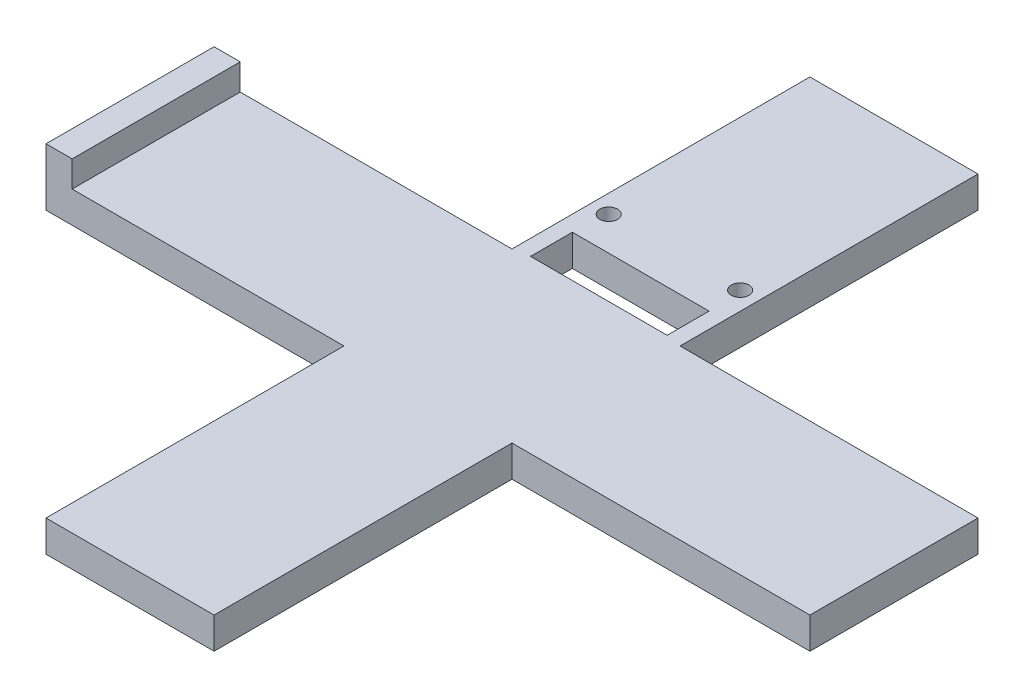
ISO-10303-21;
HEADER;
FILE_DESCRIPTION(('STEP AP214'),'2;1');
FILE_NAME('part.step','',(''),(''),'','','');
FILE_SCHEMA(('AUTOMOTIVE_DESIGN { 1 0 10303 214 1 1 1 1 }'));
ENDSEC;
DATA;
#1=APPLICATION_CONTEXT('core data for automotive mechanical design processes');
#2=APPLICATION_PROTOCOL_DEFINITION('international standard','automotive_design',2000,#1);
#3=PRODUCT_CONTEXT('',#1,'mechanical');
#4=PRODUCT('Part','Part','',(#3));
#5=PRODUCT_RELATED_PRODUCT_CATEGORY('part','',(#4));
#6=PRODUCT_DEFINITION_FORMATION('','',#4);
#7=PRODUCT_DEFINITION_CONTEXT('part definition',#1,'design');
#8=PRODUCT_DEFINITION('design','',#6,#7);
#9=PRODUCT_DEFINITION_SHAPE('','',#8);
#10=(LENGTH_UNIT() NAMED_UNIT(*) SI_UNIT(.MILLI.,.METRE.));
#11=(NAMED_UNIT(*) PLANE_ANGLE_UNIT() SI_UNIT($,.RADIAN.));
#12=(NAMED_UNIT(*) SI_UNIT($,.STERADIAN.) SOLID_ANGLE_UNIT());
#13=UNCERTAINTY_MEASURE_WITH_UNIT(LENGTH_MEASURE(1.E-05),#10,'distance_accuracy_value','');
#14=(GEOMETRIC_REPRESENTATION_CONTEXT(3) GLOBAL_UNCERTAINTY_ASSIGNED_CONTEXT((#13)) GLOBAL_UNIT_ASSIGNED_CONTEXT((#10,
#11,#12)) REPRESENTATION_CONTEXT('',''));
#15=CARTESIAN_POINT('',(0.,0.,0.));
#16=DIRECTION('',(0.,0.,1.));
#17=DIRECTION('',(1.,0.,0.));
#18=AXIS2_PLACEMENT_3D('',#15,#16,#17);
#19=CARTESIAN_POINT('',(0.,6.,0.));
#20=DIRECTION('',(0.,1.,0.));
#21=DIRECTION('',(0.,0.,1.));
#22=AXIS2_PLACEMENT_3D('',#19,#20,#21);
#23=PLANE('',#22);
#24=DIRECTION('',(0.,0.,-1.));
#25=VECTOR('',#24,1.);
#26=CARTESIAN_POINT('',(-68.0000000000001,6.,-16.06));
#27=LINE('',#26,#25);
#28=CARTESIAN_POINT('',(-68.0000000000001,6.,16.06));
#29=VERTEX_POINT('',#28);
#30=CARTESIAN_POINT('',(-68.0000000000001,6.,-16.06));
#31=VERTEX_POINT('',#30);
#32=EDGE_CURVE('E55',#29,#31,#27,.T.);
#33=ORIENTED_EDGE('',*,*,#32,.F.);
#34=DIRECTION('',(1.,0.,0.));
#35=VECTOR('',#34,1.);
#36=CARTESIAN_POINT('',(-73.0000000000001,6.,16.06));
#37=LINE('',#36,#35);
#38=CARTESIAN_POINT('',(-16.0600000000001,6.,16.06));
#39=VERTEX_POINT('',#38);
#40=EDGE_CURVE('E275',#29,#39,#37,.T.);
#41=ORIENTED_EDGE('',*,*,#40,.T.);
#42=DIRECTION('',(0.,0.,1.));
#43=VECTOR('',#42,1.);
#44=CARTESIAN_POINT('',(-16.0600000000001,6.,16.06));
#45=LINE('',#44,#43);
#46=CARTESIAN_POINT('',(-16.0600000000001,6.,73.));
#47=VERTEX_POINT('',#46);
#48=EDGE_CURVE('E278',#39,#47,#45,.T.);
#49=ORIENTED_EDGE('',*,*,#48,.T.);
#50=DIRECTION('',(1.,0.,0.));
#51=VECTOR('',#50,1.);
#52=CARTESIAN_POINT('',(-16.0600000000001,6.,73.));
#53=LINE('',#52,#51);
#54=CARTESIAN_POINT('',(16.06,6.,73.));
#55=VERTEX_POINT('',#54);
#56=EDGE_CURVE('E281',#47,#55,#53,.T.);
#57=ORIENTED_EDGE('',*,*,#56,.T.);
#58=DIRECTION('',(0.,0.,-1.));
#59=VECTOR('',#58,1.);
#60=CARTESIAN_POINT('',(16.06,6.,73.));
#61=LINE('',#60,#59);
#62=CARTESIAN_POINT('',(16.06,6.,16.06));
#63=VERTEX_POINT('',#62);
#64=EDGE_CURVE('E284',#55,#63,#61,.T.);
#65=ORIENTED_EDGE('',*,*,#64,.T.);
#66=DIRECTION('',(1.,0.,0.));
#67=VECTOR('',#66,1.);
#68=CARTESIAN_POINT('',(16.06,6.,16.06));
#69=LINE('',#68,#67);
#70=CARTESIAN_POINT('',(73.,6.,16.06));
#71=VERTEX_POINT('',#70);
#72=EDGE_CURVE('E287',#63,#71,#69,.T.);
#73=ORIENTED_EDGE('',*,*,#72,.T.);
#74=DIRECTION('',(0.,0.,-1.));
#75=VECTOR('',#74,1.);
#76=CARTESIAN_POINT('',(73.,6.,0.));
#77=LINE('',#76,#75);
#78=CARTESIAN_POINT('',(73.,6.,-16.06));
#79=VERTEX_POINT('',#78);
#80=EDGE_CURVE('E290',#71,#79,#77,.T.);
#81=ORIENTED_EDGE('',*,*,#80,.T.);
#82=DIRECTION('',(-1.,0.,0.));
#83=VECTOR('',#82,1.);
#84=CARTESIAN_POINT('',(73.,6.,-16.06));
#85=LINE('',#84,#83);
#86=CARTESIAN_POINT('',(16.06,6.,-16.06));
#87=VERTEX_POINT('',#86);
#88=EDGE_CURVE('E293',#79,#87,#85,.T.);
#89=ORIENTED_EDGE('',*,*,#88,.T.);
#90=DIRECTION('',(0.,0.,-1.));
#91=VECTOR('',#90,1.);
#92=CARTESIAN_POINT('',(16.06,6.,-16.06));
#93=LINE('',#92,#91);
#94=CARTESIAN_POINT('',(16.06,6.,-73.));
#95=VERTEX_POINT('',#94);
#96=EDGE_CURVE('E296',#87,#95,#93,.T.);
#97=ORIENTED_EDGE('',*,*,#96,.T.);
#98=DIRECTION('',(-1.,0.,0.));
#99=VECTOR('',#98,1.);
#100=CARTESIAN_POINT('',(16.06,6.,-73.));
#101=LINE('',#100,#99);
#102=CARTESIAN_POINT('',(-16.0600000000002,6.,-73.));
#103=VERTEX_POINT('',#102);
#104=EDGE_CURVE('E265',#95,#103,#101,.T.);
#105=ORIENTED_EDGE('',*,*,#104,.T.);
#106=DIRECTION('',(0.,0.,1.));
#107=VECTOR('',#106,1.);
#108=CARTESIAN_POINT('',(-16.0600000000002,6.,-73.));
#109=LINE('',#108,#107);
#110=CARTESIAN_POINT('',(-16.0600000000001,6.,-16.06));
#111=VERTEX_POINT('',#110);
#112=EDGE_CURVE('E268',#103,#111,#109,.T.);
#113=ORIENTED_EDGE('',*,*,#112,.T.);
#114=DIRECTION('',(-1.,0.,0.));
#115=VECTOR('',#114,1.);
#116=CARTESIAN_POINT('',(-16.0600000000001,6.,-16.06));
#117=LINE('',#116,#115);
#118=EDGE_CURVE('E272',#111,#31,#117,.T.);
#119=ORIENTED_EDGE('',*,*,#118,.T.);
#120=EDGE_LOOP('',(#33,#41,#49,#57,#65,#73,#81,#89,#97,#105,#113,#119));
#121=FACE_BOUND('',#120,.T.);
#122=CARTESIAN_POINT('',(-12.56,6.,-31.04));
#123=DIRECTION('',(0.,1.,0.));
#124=DIRECTION('',(0.,0.,1.));
#125=AXIS2_PLACEMENT_3D('',#122,#123,#124);
#126=CIRCLE('',#125,1.7);
#127=CARTESIAN_POINT('',(-12.56,6.,-29.34));
#128=VERTEX_POINT('',#127);
#129=EDGE_CURVE('E216',#128,#128,#126,.T.);
#130=ORIENTED_EDGE('',*,*,#129,.F.);
#131=EDGE_LOOP('',(#130));
#132=FACE_BOUND('',#131,.T.);
#133=DIRECTION('',(1.,0.,0.));
#134=VECTOR('',#133,1.);
#135=CARTESIAN_POINT('',(13.06,6.,-16.6));
#136=LINE('',#135,#134);
#137=CARTESIAN_POINT('',(-13.06,6.,-16.6));
#138=VERTEX_POINT('',#137);
#139=CARTESIAN_POINT('',(13.06,6.,-16.6));
#140=VERTEX_POINT('',#139);
#141=EDGE_CURVE('E227',#138,#140,#136,.T.);
#142=ORIENTED_EDGE('',*,*,#141,.F.);
#143=DIRECTION('',(0.,0.,1.));
#144=VECTOR('',#143,1.);
#145=CARTESIAN_POINT('',(-13.06,6.,-16.6));
#146=LINE('',#145,#144);
#147=CARTESIAN_POINT('',(-13.06,6.,-24.6));
#148=VERTEX_POINT('',#147);
#149=EDGE_CURVE('E224',#148,#138,#146,.T.);
#150=ORIENTED_EDGE('',*,*,#149,.F.);
#151=DIRECTION('',(-1.,0.,0.));
#152=VECTOR('',#151,1.);
#153=CARTESIAN_POINT('',(13.06,6.,-24.6));
#154=LINE('',#153,#152);
#155=CARTESIAN_POINT('',(13.06,6.,-24.6));
#156=VERTEX_POINT('',#155);
#157=EDGE_CURVE('E234',#156,#148,#154,.T.);
#158=ORIENTED_EDGE('',*,*,#157,.F.);
#159=DIRECTION('',(0.,0.,-1.));
#160=VECTOR('',#159,1.);
#161=CARTESIAN_POINT('',(13.06,6.,-16.6));
#162=LINE('',#161,#160);
#163=EDGE_CURVE('E231',#140,#156,#162,.T.);
#164=ORIENTED_EDGE('',*,*,#163,.F.);
#165=EDGE_LOOP('',(#142,#150,#158,#164));
#166=FACE_BOUND('',#165,.T.);
#167=CARTESIAN_POINT('',(12.56,6.,-31.04));
#168=DIRECTION('',(0.,1.,0.));
#169=DIRECTION('',(0.,0.,1.));
#170=AXIS2_PLACEMENT_3D('',#167,#168,#169);
#171=CIRCLE('',#170,1.7);
#172=CARTESIAN_POINT('',(12.56,6.,-29.34));
#173=VERTEX_POINT('',#172);
#174=EDGE_CURVE('E208',#173,#173,#171,.T.);
#175=ORIENTED_EDGE('',*,*,#174,.F.);
#176=EDGE_LOOP('',(#175));
#177=FACE_BOUND('',#176,.T.);
#178=ADVANCED_FACE('F39',(#121,#132,#166,#177),#23,.T.);
#179=CARTESIAN_POINT('',(0.,0.,0.));
#180=DIRECTION('',(0.,1.,0.));
#181=DIRECTION('',(0.,0.,1.));
#182=AXIS2_PLACEMENT_3D('',#179,#180,#181);
#183=PLANE('',#182);
#184=DIRECTION('',(-1.,0.,0.));
#185=VECTOR('',#184,1.);
#186=CARTESIAN_POINT('',(2.0122792321331E-13,0.,-73.));
#187=LINE('',#186,#185);
#188=CARTESIAN_POINT('',(16.06,0.,-73.));
#189=VERTEX_POINT('',#188);
#190=CARTESIAN_POINT('',(-16.0600000000002,0.,-73.));
#191=VERTEX_POINT('',#190);
#192=EDGE_CURVE('E264',#189,#191,#187,.T.);
#193=ORIENTED_EDGE('',*,*,#192,.F.);
#194=DIRECTION('',(0.,0.,-1.));
#195=VECTOR('',#194,1.);
#196=CARTESIAN_POINT('',(16.06,0.,-16.06));
#197=LINE('',#196,#195);
#198=CARTESIAN_POINT('',(16.06,0.,-16.06));
#199=VERTEX_POINT('',#198);
#200=EDGE_CURVE('E269',#199,#189,#197,.T.);
#201=ORIENTED_EDGE('',*,*,#200,.F.);
#202=DIRECTION('',(-1.,0.,0.));
#203=VECTOR('',#202,1.);
#204=CARTESIAN_POINT('',(73.,0.,-16.06));
#205=LINE('',#204,#203);
#206=CARTESIAN_POINT('',(73.,0.,-16.06));
#207=VERTEX_POINT('',#206);
#208=EDGE_CURVE('E331',#207,#199,#205,.T.);
#209=ORIENTED_EDGE('',*,*,#208,.F.);
#210=DIRECTION('',(0.,0.,-1.));
#211=VECTOR('',#210,1.);
#212=CARTESIAN_POINT('',(73.,0.,0.));
#213=LINE('',#212,#211);
#214=CARTESIAN_POINT('',(73.,0.,16.06));
#215=VERTEX_POINT('',#214);
#216=EDGE_CURVE('E328',#215,#207,#213,.T.);
#217=ORIENTED_EDGE('',*,*,#216,.F.);
#218=DIRECTION('',(1.,0.,0.));
#219=VECTOR('',#218,1.);
#220=CARTESIAN_POINT('',(16.06,0.,16.06));
#221=LINE('',#220,#219);
#222=CARTESIAN_POINT('',(16.06,0.,16.06));
#223=VERTEX_POINT('',#222);
#224=EDGE_CURVE('E324',#223,#215,#221,.T.);
#225=ORIENTED_EDGE('',*,*,#224,.F.);
#226=DIRECTION('',(0.,0.,-1.));
#227=VECTOR('',#226,1.);
#228=CARTESIAN_POINT('',(16.06,0.,73.));
#229=LINE('',#228,#227);
#230=CARTESIAN_POINT('',(16.06,0.,73.));
#231=VERTEX_POINT('',#230);
#232=EDGE_CURVE('E321',#231,#223,#229,.T.);
#233=ORIENTED_EDGE('',*,*,#232,.F.);
#234=DIRECTION('',(1.,0.,0.));
#235=VECTOR('',#234,1.);
#236=CARTESIAN_POINT('',(0.,0.,73.));
#237=LINE('',#236,#235);
#238=CARTESIAN_POINT('',(-16.0600000000001,0.,73.));
#239=VERTEX_POINT('',#238);
#240=EDGE_CURVE('E318',#239,#231,#237,.T.);
#241=ORIENTED_EDGE('',*,*,#240,.F.);
#242=DIRECTION('',(0.,0.,1.));
#243=VECTOR('',#242,1.);
#244=CARTESIAN_POINT('',(-16.0600000000001,0.,16.06));
#245=LINE('',#244,#243);
#246=CARTESIAN_POINT('',(-16.0600000000001,0.,16.06));
#247=VERTEX_POINT('',#246);
#248=EDGE_CURVE('E314',#247,#239,#245,.T.);
#249=ORIENTED_EDGE('',*,*,#248,.F.);
#250=DIRECTION('',(1.,0.,0.));
#251=VECTOR('',#250,1.);
#252=CARTESIAN_POINT('',(-73.0000000000001,0.,16.06));
#253=LINE('',#252,#251);
#254=CARTESIAN_POINT('',(-73.0000000000001,0.,16.06));
#255=VERTEX_POINT('',#254);
#256=EDGE_CURVE('E311',#255,#247,#253,.T.);
#257=ORIENTED_EDGE('',*,*,#256,.F.);
#258=DIRECTION('',(0.,0.,1.));
#259=VECTOR('',#258,1.);
#260=CARTESIAN_POINT('',(-73.0000000000001,0.,16.06));
#261=LINE('',#260,#259);
#262=CARTESIAN_POINT('',(-73.0000000000001,0.,-16.06));
#263=VERTEX_POINT('',#262);
#264=EDGE_CURVE('E171',#263,#255,#261,.T.);
#265=ORIENTED_EDGE('',*,*,#264,.F.);
#266=DIRECTION('',(-1.,0.,0.));
#267=VECTOR('',#266,1.);
#268=CARTESIAN_POINT('',(-16.0600000000001,0.,-16.06));
#269=LINE('',#268,#267);
#270=CARTESIAN_POINT('',(-16.0600000000001,0.,-16.06));
#271=VERTEX_POINT('',#270);
#272=EDGE_CURVE('E305',#271,#263,#269,.T.);
#273=ORIENTED_EDGE('',*,*,#272,.F.);
#274=DIRECTION('',(0.,0.,1.));
#275=VECTOR('',#274,1.);
#276=CARTESIAN_POINT('',(-16.0600000000002,0.,-73.));
#277=LINE('',#276,#275);
#278=EDGE_CURVE('E302',#191,#271,#277,.T.);
#279=ORIENTED_EDGE('',*,*,#278,.F.);
#280=EDGE_LOOP('',(#193,#201,#209,#217,#225,#233,#241,#249,#257,#265,#273,#279));
#281=FACE_BOUND('',#280,.T.);
#282=DIRECTION('',(0.,0.,1.));
#283=VECTOR('',#282,1.);
#284=CARTESIAN_POINT('',(-13.06,0.,-16.6));
#285=LINE('',#284,#283);
#286=CARTESIAN_POINT('',(-13.06,0.,-24.6));
#287=VERTEX_POINT('',#286);
#288=CARTESIAN_POINT('',(-13.06,0.,-16.6));
#289=VERTEX_POINT('',#288);
#290=EDGE_CURVE('E220',#287,#289,#285,.T.);
#291=ORIENTED_EDGE('',*,*,#290,.T.);
#292=DIRECTION('',(1.,0.,0.));
#293=VECTOR('',#292,1.);
#294=CARTESIAN_POINT('',(13.06,0.,-16.6));
#295=LINE('',#294,#293);
#296=CARTESIAN_POINT('',(13.06,0.,-16.6));
#297=VERTEX_POINT('',#296);
#298=EDGE_CURVE('E241',#289,#297,#295,.T.);
#299=ORIENTED_EDGE('',*,*,#298,.T.);
#300=DIRECTION('',(0.,0.,-1.));
#301=VECTOR('',#300,1.);
#302=CARTESIAN_POINT('',(13.06,0.,-16.6));
#303=LINE('',#302,#301);
#304=CARTESIAN_POINT('',(13.06,0.,-24.6));
#305=VERTEX_POINT('',#304);
#306=EDGE_CURVE('E245',#297,#305,#303,.T.);
#307=ORIENTED_EDGE('',*,*,#306,.T.);
#308=DIRECTION('',(-1.,0.,0.));
#309=VECTOR('',#308,1.);
#310=CARTESIAN_POINT('',(13.06,0.,-24.6));
#311=LINE('',#310,#309);
#312=EDGE_CURVE('E228',#305,#287,#311,.T.);
#313=ORIENTED_EDGE('',*,*,#312,.T.);
#314=EDGE_LOOP('',(#291,#299,#307,#313));
#315=FACE_BOUND('',#314,.T.);
#316=CARTESIAN_POINT('',(-12.56,0.,-31.04));
#317=DIRECTION('',(0.,1.,0.));
#318=DIRECTION('',(0.,0.,1.));
#319=AXIS2_PLACEMENT_3D('',#316,#317,#318);
#320=CIRCLE('',#319,1.7);
#321=CARTESIAN_POINT('',(-12.56,0.,-29.34));
#322=VERTEX_POINT('',#321);
#323=EDGE_CURVE('E212',#322,#322,#320,.T.);
#324=ORIENTED_EDGE('',*,*,#323,.T.);
#325=EDGE_LOOP('',(#324));
#326=FACE_BOUND('',#325,.T.);
#327=CARTESIAN_POINT('',(12.56,0.,-31.04));
#328=DIRECTION('',(0.,1.,0.));
#329=DIRECTION('',(0.,0.,1.));
#330=AXIS2_PLACEMENT_3D('',#327,#328,#329);
#331=CIRCLE('',#330,1.7);
#332=CARTESIAN_POINT('',(12.56,0.,-29.34));
#333=VERTEX_POINT('',#332);
#334=EDGE_CURVE('E207',#333,#333,#331,.T.);
#335=ORIENTED_EDGE('',*,*,#334,.T.);
#336=EDGE_LOOP('',(#335));
#337=FACE_BOUND('',#336,.T.);
#338=ADVANCED_FACE('F379',(#281,#315,#326,#337),#183,.F.);
#339=CARTESIAN_POINT('',(2.0122792321331E-13,6.,-73.));
#340=DIRECTION('',(0.,0.,1.));
#341=DIRECTION('',(1.,0.,0.));
#342=AXIS2_PLACEMENT_3D('',#339,#340,#341);
#343=PLANE('',#342);
#344=ORIENTED_EDGE('',*,*,#192,.T.);
#345=DIRECTION('',(0.,-1.,0.));
#346=VECTOR('',#345,1.);
#347=CARTESIAN_POINT('',(-16.0600000000002,6.,-73.));
#348=LINE('',#347,#346);
#349=EDGE_CURVE('E11',#103,#191,#348,.T.);
#350=ORIENTED_EDGE('',*,*,#349,.F.);
#351=ORIENTED_EDGE('',*,*,#104,.F.);
#352=DIRECTION('',(0.,-1.,0.));
#353=VECTOR('',#352,1.);
#354=CARTESIAN_POINT('',(16.06,6.,-73.));
#355=LINE('',#354,#353);
#356=EDGE_CURVE('E299',#95,#189,#355,.T.);
#357=ORIENTED_EDGE('',*,*,#356,.T.);
#358=EDGE_LOOP('',(#344,#350,#351,#357));
#359=FACE_BOUND('',#358,.T.);
#360=ADVANCED_FACE('F41',(#359),#343,.F.);
#361=CARTESIAN_POINT('',(-16.0600000000002,6.,-73.));
#362=DIRECTION('',(1.,0.,0.));
#363=DIRECTION('',(0.,0.,-1.));
#364=AXIS2_PLACEMENT_3D('',#361,#362,#363);
#365=PLANE('',#364);
#366=ORIENTED_EDGE('',*,*,#278,.T.);
#367=DIRECTION('',(0.,-1.,0.));
#368=VECTOR('',#367,1.);
#369=CARTESIAN_POINT('',(-16.0600000000001,6.,-16.06));
#370=LINE('',#369,#368);
#371=EDGE_CURVE('E48',#111,#271,#370,.T.);
#372=ORIENTED_EDGE('',*,*,#371,.F.);
#373=ORIENTED_EDGE('',*,*,#112,.F.);
#374=ORIENTED_EDGE('',*,*,#349,.T.);
#375=EDGE_LOOP('',(#366,#372,#373,#374));
#376=FACE_BOUND('',#375,.T.);
#377=ADVANCED_FACE('F445',(#376),#365,.F.);
#378=CARTESIAN_POINT('',(-16.0600000000001,6.,-16.06));
#379=DIRECTION('',(0.,0.,1.));
#380=DIRECTION('',(1.,0.,0.));
#381=AXIS2_PLACEMENT_3D('',#378,#379,#380);
#382=PLANE('',#381);
#383=ORIENTED_EDGE('',*,*,#272,.T.);
#384=DIRECTION('',(0.,-1.,0.));
#385=VECTOR('',#384,1.);
#386=CARTESIAN_POINT('',(-73.0000000000001,6.,-16.06));
#387=LINE('',#386,#385);
#388=CARTESIAN_POINT('',(-73.0000000000001,11.,-16.06));
#389=VERTEX_POINT('',#388);
#390=EDGE_CURVE('E175',#389,#263,#387,.T.);
#391=ORIENTED_EDGE('',*,*,#390,.F.);
#392=DIRECTION('',(-1.,0.,0.));
#393=VECTOR('',#392,1.);
#394=CARTESIAN_POINT('',(-73.0000000000001,11.,-16.06));
#395=LINE('',#394,#393);
#396=CARTESIAN_POINT('',(-68.0000000000001,11.,-16.06));
#397=VERTEX_POINT('',#396);
#398=EDGE_CURVE('E191',#397,#389,#395,.T.);
#399=ORIENTED_EDGE('',*,*,#398,.F.);
#400=DIRECTION('',(0.,-1.,0.));
#401=VECTOR('',#400,1.);
#402=CARTESIAN_POINT('',(-68.0000000000001,11.,-16.06));
#403=LINE('',#402,#401);
#404=EDGE_CURVE('E200',#397,#31,#403,.T.);
#405=ORIENTED_EDGE('',*,*,#404,.T.);
#406=ORIENTED_EDGE('',*,*,#118,.F.);
#407=ORIENTED_EDGE('',*,*,#371,.T.);
#408=EDGE_LOOP('',(#383,#391,#399,#405,#406,#407));
#409=FACE_BOUND('',#408,.T.);
#410=ADVANCED_FACE('F374',(#409),#382,.F.);
#411=CARTESIAN_POINT('',(-73.0000000000001,6.,16.06));
#412=DIRECTION('',(1.,0.,0.));
#413=DIRECTION('',(0.,0.,-1.));
#414=AXIS2_PLACEMENT_3D('',#411,#412,#413);
#415=PLANE('',#414);
#416=ORIENTED_EDGE('',*,*,#264,.T.);
#417=DIRECTION('',(0.,-1.,0.));
#418=VECTOR('',#417,1.);
#419=CARTESIAN_POINT('',(-73.0000000000001,6.,16.06));
#420=LINE('',#419,#418);
#421=CARTESIAN_POINT('',(-73.0000000000001,11.,16.06));
#422=VERTEX_POINT('',#421);
#423=EDGE_CURVE('E165',#422,#255,#420,.T.);
#424=ORIENTED_EDGE('',*,*,#423,.F.);
#425=DIRECTION('',(0.,0.,1.));
#426=VECTOR('',#425,1.);
#427=CARTESIAN_POINT('',(-73.0000000000001,11.,-16.06));
#428=LINE('',#427,#426);
#429=EDGE_CURVE('E170',#389,#422,#428,.T.);
#430=ORIENTED_EDGE('',*,*,#429,.F.);
#431=ORIENTED_EDGE('',*,*,#390,.T.);
#432=EDGE_LOOP('',(#416,#424,#430,#431));
#433=FACE_BOUND('',#432,.T.);
#434=ADVANCED_FACE('F167',(#433),#415,.F.);
#435=CARTESIAN_POINT('',(-73.0000000000001,6.,16.06));
#436=DIRECTION('',(0.,0.,-1.));
#437=DIRECTION('',(-1.,0.,0.));
#438=AXIS2_PLACEMENT_3D('',#435,#436,#437);
#439=PLANE('',#438);
#440=ORIENTED_EDGE('',*,*,#256,.T.);
#441=DIRECTION('',(0.,-1.,0.));
#442=VECTOR('',#441,1.);
#443=CARTESIAN_POINT('',(-16.0600000000001,6.,16.06));
#444=LINE('',#443,#442);
#445=EDGE_CURVE('E176',#39,#247,#444,.T.);
#446=ORIENTED_EDGE('',*,*,#445,.F.);
#447=ORIENTED_EDGE('',*,*,#40,.F.);
#448=DIRECTION('',(0.,-1.,0.));
#449=VECTOR('',#448,1.);
#450=CARTESIAN_POINT('',(-68.0000000000001,11.,16.06));
#451=LINE('',#450,#449);
#452=CARTESIAN_POINT('',(-68.0000000000001,11.,16.06));
#453=VERTEX_POINT('',#452);
#454=EDGE_CURVE('E182',#453,#29,#451,.T.);
#455=ORIENTED_EDGE('',*,*,#454,.F.);
#456=DIRECTION('',(1.,0.,0.));
#457=VECTOR('',#456,1.);
#458=CARTESIAN_POINT('',(-73.0000000000001,11.,16.06));
#459=LINE('',#458,#457);
#460=EDGE_CURVE('E179',#422,#453,#459,.T.);
#461=ORIENTED_EDGE('',*,*,#460,.F.);
#462=ORIENTED_EDGE('',*,*,#423,.T.);
#463=EDGE_LOOP('',(#440,#446,#447,#455,#461,#462));
#464=FACE_BOUND('',#463,.T.);
#465=ADVANCED_FACE('F180',(#464),#439,.F.);
#466=CARTESIAN_POINT('',(-16.0600000000001,6.,16.06));
#467=DIRECTION('',(1.,0.,0.));
#468=DIRECTION('',(0.,0.,-1.));
#469=AXIS2_PLACEMENT_3D('',#466,#467,#468);
#470=PLANE('',#469);
#471=ORIENTED_EDGE('',*,*,#248,.T.);
#472=DIRECTION('',(0.,-1.,0.));
#473=VECTOR('',#472,1.);
#474=CARTESIAN_POINT('',(-16.0600000000001,6.,73.));
#475=LINE('',#474,#473);
#476=EDGE_CURVE('E360',#47,#239,#475,.T.);
#477=ORIENTED_EDGE('',*,*,#476,.F.);
#478=ORIENTED_EDGE('',*,*,#48,.F.);
#479=ORIENTED_EDGE('',*,*,#445,.T.);
#480=EDGE_LOOP('',(#471,#477,#478,#479));
#481=FACE_BOUND('',#480,.T.);
#482=ADVANCED_FACE('F385',(#481),#470,.F.);
#483=CARTESIAN_POINT('',(0.,6.,73.));
#484=DIRECTION('',(0.,0.,-1.));
#485=DIRECTION('',(-1.,0.,0.));
#486=AXIS2_PLACEMENT_3D('',#483,#484,#485);
#487=PLANE('',#486);
#488=ORIENTED_EDGE('',*,*,#240,.T.);
#489=DIRECTION('',(0.,-1.,0.));
#490=VECTOR('',#489,1.);
#491=CARTESIAN_POINT('',(16.06,6.,73.));
#492=LINE('',#491,#490);
#493=EDGE_CURVE('E356',#55,#231,#492,.T.);
#494=ORIENTED_EDGE('',*,*,#493,.F.);
#495=ORIENTED_EDGE('',*,*,#56,.F.);
#496=ORIENTED_EDGE('',*,*,#476,.T.);
#497=EDGE_LOOP('',(#488,#494,#495,#496));
#498=FACE_BOUND('',#497,.T.);
#499=ADVANCED_FACE('F433',(#498),#487,.F.);
#500=CARTESIAN_POINT('',(16.06,6.,73.));
#501=DIRECTION('',(-1.,0.,0.));
#502=DIRECTION('',(0.,0.,1.));
#503=AXIS2_PLACEMENT_3D('',#500,#501,#502);
#504=PLANE('',#503);
#505=ORIENTED_EDGE('',*,*,#232,.T.);
#506=DIRECTION('',(0.,-1.,0.));
#507=VECTOR('',#506,1.);
#508=CARTESIAN_POINT('',(16.06,6.,16.06));
#509=LINE('',#508,#507);
#510=EDGE_CURVE('E352',#63,#223,#509,.T.);
#511=ORIENTED_EDGE('',*,*,#510,.F.);
#512=ORIENTED_EDGE('',*,*,#64,.F.);
#513=ORIENTED_EDGE('',*,*,#493,.T.);
#514=EDGE_LOOP('',(#505,#511,#512,#513));
#515=FACE_BOUND('',#514,.T.);
#516=ADVANCED_FACE('F429',(#515),#504,.F.);
#517=CARTESIAN_POINT('',(16.06,6.,16.06));
#518=DIRECTION('',(0.,0.,-1.));
#519=DIRECTION('',(-1.,0.,0.));
#520=AXIS2_PLACEMENT_3D('',#517,#518,#519);
#521=PLANE('',#520);
#522=ORIENTED_EDGE('',*,*,#224,.T.);
#523=DIRECTION('',(0.,-1.,0.));
#524=VECTOR('',#523,1.);
#525=CARTESIAN_POINT('',(73.,6.,16.06));
#526=LINE('',#525,#524);
#527=EDGE_CURVE('E348',#71,#215,#526,.T.);
#528=ORIENTED_EDGE('',*,*,#527,.F.);
#529=ORIENTED_EDGE('',*,*,#72,.F.);
#530=ORIENTED_EDGE('',*,*,#510,.T.);
#531=EDGE_LOOP('',(#522,#528,#529,#530));
#532=FACE_BOUND('',#531,.T.);
#533=ADVANCED_FACE('F425',(#532),#521,.F.);
#534=CARTESIAN_POINT('',(73.,6.,0.));
#535=DIRECTION('',(-1.,0.,0.));
#536=DIRECTION('',(0.,0.,1.));
#537=AXIS2_PLACEMENT_3D('',#534,#535,#536);
#538=PLANE('',#537);
#539=ORIENTED_EDGE('',*,*,#216,.T.);
#540=DIRECTION('',(0.,-1.,0.));
#541=VECTOR('',#540,1.);
#542=CARTESIAN_POINT('',(73.,6.,-16.06));
#543=LINE('',#542,#541);
#544=EDGE_CURVE('E344',#79,#207,#543,.T.);
#545=ORIENTED_EDGE('',*,*,#544,.F.);
#546=ORIENTED_EDGE('',*,*,#80,.F.);
#547=ORIENTED_EDGE('',*,*,#527,.T.);
#548=EDGE_LOOP('',(#539,#545,#546,#547));
#549=FACE_BOUND('',#548,.T.);
#550=ADVANCED_FACE('F421',(#549),#538,.F.);
#551=CARTESIAN_POINT('',(73.,6.,-16.06));
#552=DIRECTION('',(0.,0.,1.));
#553=DIRECTION('',(1.,0.,0.));
#554=AXIS2_PLACEMENT_3D('',#551,#552,#553);
#555=PLANE('',#554);
#556=ORIENTED_EDGE('',*,*,#208,.T.);
#557=DIRECTION('',(0.,-1.,0.));
#558=VECTOR('',#557,1.);
#559=CARTESIAN_POINT('',(16.06,6.,-16.06));
#560=LINE('',#559,#558);
#561=EDGE_CURVE('E340',#87,#199,#560,.T.);
#562=ORIENTED_EDGE('',*,*,#561,.F.);
#563=ORIENTED_EDGE('',*,*,#88,.F.);
#564=ORIENTED_EDGE('',*,*,#544,.T.);
#565=EDGE_LOOP('',(#556,#562,#563,#564));
#566=FACE_BOUND('',#565,.T.);
#567=ADVANCED_FACE('F417',(#566),#555,.F.);
#568=CARTESIAN_POINT('',(16.06,6.,-16.06));
#569=DIRECTION('',(-1.,0.,0.));
#570=DIRECTION('',(0.,0.,1.));
#571=AXIS2_PLACEMENT_3D('',#568,#569,#570);
#572=PLANE('',#571);
#573=ORIENTED_EDGE('',*,*,#200,.T.);
#574=ORIENTED_EDGE('',*,*,#356,.F.);
#575=ORIENTED_EDGE('',*,*,#96,.F.);
#576=ORIENTED_EDGE('',*,*,#561,.T.);
#577=EDGE_LOOP('',(#573,#574,#575,#576));
#578=FACE_BOUND('',#577,.T.);
#579=ADVANCED_FACE('F414',(#578),#572,.F.);
#580=CARTESIAN_POINT('',(-13.06,6.,-16.6));
#581=DIRECTION('',(1.,0.,0.));
#582=DIRECTION('',(0.,0.,-1.));
#583=AXIS2_PLACEMENT_3D('',#580,#581,#582);
#584=PLANE('',#583);
#585=ORIENTED_EDGE('',*,*,#290,.F.);
#586=DIRECTION('',(0.,-1.,0.));
#587=VECTOR('',#586,1.);
#588=CARTESIAN_POINT('',(-13.06,6.,-24.6));
#589=LINE('',#588,#587);
#590=EDGE_CURVE('E237',#148,#287,#589,.T.);
#591=ORIENTED_EDGE('',*,*,#590,.F.);
#592=ORIENTED_EDGE('',*,*,#149,.T.);
#593=DIRECTION('',(0.,-1.,0.));
#594=VECTOR('',#593,1.);
#595=CARTESIAN_POINT('',(-13.06,6.,-16.6));
#596=LINE('',#595,#594);
#597=EDGE_CURVE('E260',#138,#289,#596,.T.);
#598=ORIENTED_EDGE('',*,*,#597,.T.);
#599=EDGE_LOOP('',(#585,#591,#592,#598));
#600=FACE_BOUND('',#599,.T.);
#601=ADVANCED_FACE('F411',(#600),#584,.T.);
#602=CARTESIAN_POINT('',(13.06,6.,-16.6));
#603=DIRECTION('',(0.,0.,-1.));
#604=DIRECTION('',(-1.,0.,0.));
#605=AXIS2_PLACEMENT_3D('',#602,#603,#604);
#606=PLANE('',#605);
#607=ORIENTED_EDGE('',*,*,#298,.F.);
#608=ORIENTED_EDGE('',*,*,#597,.F.);
#609=ORIENTED_EDGE('',*,*,#141,.T.);
#610=DIRECTION('',(0.,-1.,0.));
#611=VECTOR('',#610,1.);
#612=CARTESIAN_POINT('',(13.06,6.,-16.6));
#613=LINE('',#612,#611);
#614=EDGE_CURVE('E257',#140,#297,#613,.T.);
#615=ORIENTED_EDGE('',*,*,#614,.T.);
#616=EDGE_LOOP('',(#607,#608,#609,#615));
#617=FACE_BOUND('',#616,.T.);
#618=ADVANCED_FACE('F562',(#617),#606,.T.);
#619=CARTESIAN_POINT('',(13.06,6.,-16.6));
#620=DIRECTION('',(-1.,0.,0.));
#621=DIRECTION('',(0.,0.,1.));
#622=AXIS2_PLACEMENT_3D('',#619,#620,#621);
#623=PLANE('',#622);
#624=ORIENTED_EDGE('',*,*,#306,.F.);
#625=ORIENTED_EDGE('',*,*,#614,.F.);
#626=ORIENTED_EDGE('',*,*,#163,.T.);
#627=DIRECTION('',(0.,-1.,0.));
#628=VECTOR('',#627,1.);
#629=CARTESIAN_POINT('',(13.06,6.,-24.6));
#630=LINE('',#629,#628);
#631=EDGE_CURVE('E63',#156,#305,#630,.T.);
#632=ORIENTED_EDGE('',*,*,#631,.T.);
#633=EDGE_LOOP('',(#624,#625,#626,#632));
#634=FACE_BOUND('',#633,.T.);
#635=ADVANCED_FACE('F570',(#634),#623,.T.);
#636=CARTESIAN_POINT('',(13.06,6.,-24.6));
#637=DIRECTION('',(0.,0.,1.));
#638=DIRECTION('',(1.,0.,0.));
#639=AXIS2_PLACEMENT_3D('',#636,#637,#638);
#640=PLANE('',#639);
#641=ORIENTED_EDGE('',*,*,#312,.F.);
#642=ORIENTED_EDGE('',*,*,#631,.F.);
#643=ORIENTED_EDGE('',*,*,#157,.T.);
#644=ORIENTED_EDGE('',*,*,#590,.T.);
#645=EDGE_LOOP('',(#641,#642,#643,#644));
#646=FACE_BOUND('',#645,.T.);
#647=ADVANCED_FACE('F578',(#646),#640,.T.);
#648=CARTESIAN_POINT('',(-12.56,6.,-31.04));
#649=DIRECTION('',(0.,-1.,0.));
#650=DIRECTION('',(0.,0.,-1.));
#651=AXIS2_PLACEMENT_3D('',#648,#649,#650);
#652=CYLINDRICAL_SURFACE('',#651,1.7);
#653=ORIENTED_EDGE('',*,*,#129,.T.);
#654=EDGE_LOOP('',(#653));
#655=FACE_BOUND('',#654,.T.);
#656=ORIENTED_EDGE('',*,*,#323,.F.);
#657=EDGE_LOOP('',(#656));
#658=FACE_BOUND('',#657,.T.);
#659=ADVANCED_FACE('F401',(#655,#658),#652,.F.);
#660=CARTESIAN_POINT('',(12.56,6.,-31.04));
#661=DIRECTION('',(0.,-1.,0.));
#662=DIRECTION('',(0.,0.,-1.));
#663=AXIS2_PLACEMENT_3D('',#660,#661,#662);
#664=CYLINDRICAL_SURFACE('',#663,1.7);
#665=ORIENTED_EDGE('',*,*,#174,.T.);
#666=EDGE_LOOP('',(#665));
#667=FACE_BOUND('',#666,.T.);
#668=ORIENTED_EDGE('',*,*,#334,.F.);
#669=EDGE_LOOP('',(#668));
#670=FACE_BOUND('',#669,.T.);
#671=ADVANCED_FACE('F394',(#667,#670),#664,.F.);
#672=CARTESIAN_POINT('',(-68.0000000000001,11.,-16.06));
#673=DIRECTION('',(-1.,0.,0.));
#674=DIRECTION('',(0.,0.,1.));
#675=AXIS2_PLACEMENT_3D('',#672,#673,#674);
#676=PLANE('',#675);
#677=ORIENTED_EDGE('',*,*,#32,.T.);
#678=ORIENTED_EDGE('',*,*,#404,.F.);
#679=DIRECTION('',(0.,0.,-1.));
#680=VECTOR('',#679,1.);
#681=CARTESIAN_POINT('',(-68.0000000000001,11.,-16.06));
#682=LINE('',#681,#680);
#683=EDGE_CURVE('E186',#453,#397,#682,.T.);
#684=ORIENTED_EDGE('',*,*,#683,.F.);
#685=ORIENTED_EDGE('',*,*,#454,.T.);
#686=EDGE_LOOP('',(#677,#678,#684,#685));
#687=FACE_BOUND('',#686,.T.);
#688=ADVANCED_FACE('F391',(#687),#676,.F.);
#689=CARTESIAN_POINT('',(0.,11.,0.));
#690=DIRECTION('',(0.,1.,0.));
#691=DIRECTION('',(0.,0.,1.));
#692=AXIS2_PLACEMENT_3D('',#689,#690,#691);
#693=PLANE('',#692);
#694=ORIENTED_EDGE('',*,*,#429,.T.);
#695=ORIENTED_EDGE('',*,*,#460,.T.);
#696=ORIENTED_EDGE('',*,*,#683,.T.);
#697=ORIENTED_EDGE('',*,*,#398,.T.);
#698=EDGE_LOOP('',(#694,#695,#696,#697));
#699=FACE_BOUND('',#698,.T.);
#700=ADVANCED_FACE('F189',(#699),#693,.T.);
#701=CLOSED_SHELL('',(#178,#338,#360,#377,#410,#434,#465,#482,#499,#516,#533,#550,#567,#579,
#601,#618,#635,#647,#659,#671,#688,#700));
#702=MANIFOLD_SOLID_BREP('B2',#701);
#703=ADVANCED_BREP_SHAPE_REPRESENTATION('',(#18,#702),#14);
#704=SHAPE_DEFINITION_REPRESENTATION(#9,#703);
ENDSEC;
END-ISO-10303-21;
